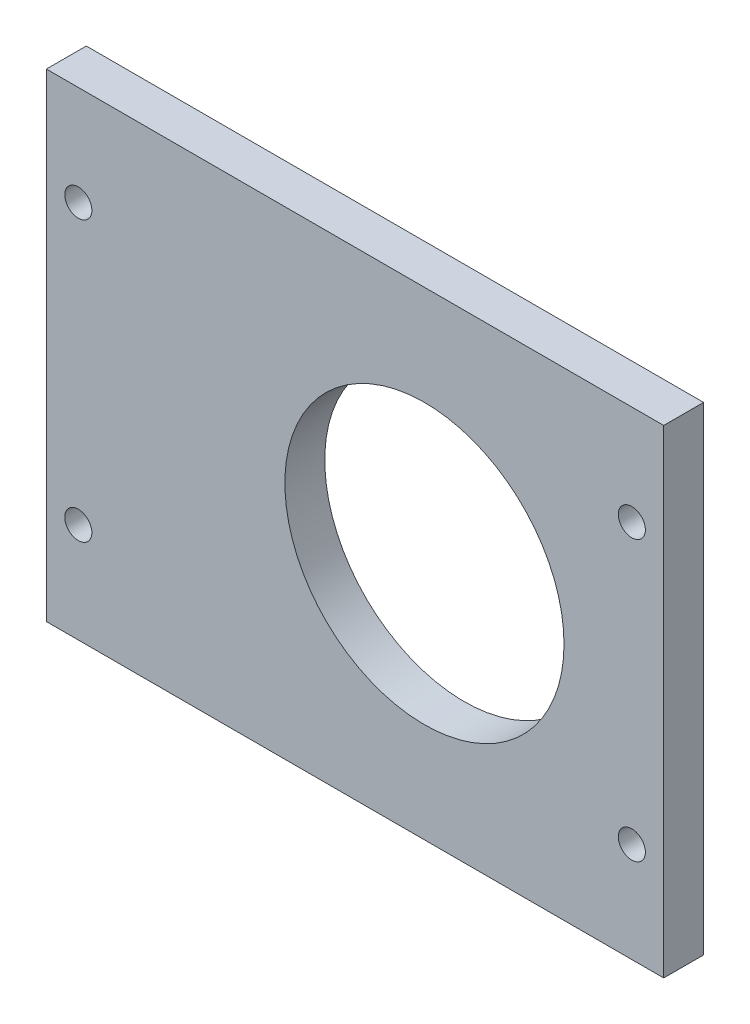
ISO-10303-21;
HEADER;
FILE_DESCRIPTION(('STEP AP214'),'2;1');
FILE_NAME('part.step','',(''),(''),'','','');
FILE_SCHEMA(('AUTOMOTIVE_DESIGN { 1 0 10303 214 1 1 1 1 }'));
ENDSEC;
DATA;
#1=APPLICATION_CONTEXT('core data for automotive mechanical design processes');
#2=APPLICATION_PROTOCOL_DEFINITION('international standard','automotive_design',2000,#1);
#3=PRODUCT_CONTEXT('',#1,'mechanical');
#4=PRODUCT('Part','Part','',(#3));
#5=PRODUCT_RELATED_PRODUCT_CATEGORY('part','',(#4));
#6=PRODUCT_DEFINITION_FORMATION('','',#4);
#7=PRODUCT_DEFINITION_CONTEXT('part definition',#1,'design');
#8=PRODUCT_DEFINITION('design','',#6,#7);
#9=PRODUCT_DEFINITION_SHAPE('','',#8);
#10=(LENGTH_UNIT() NAMED_UNIT(*) SI_UNIT(.MILLI.,.METRE.));
#11=(NAMED_UNIT(*) PLANE_ANGLE_UNIT() SI_UNIT($,.RADIAN.));
#12=(NAMED_UNIT(*) SI_UNIT($,.STERADIAN.) SOLID_ANGLE_UNIT());
#13=UNCERTAINTY_MEASURE_WITH_UNIT(LENGTH_MEASURE(1.E-05),#10,'distance_accuracy_value','');
#14=(GEOMETRIC_REPRESENTATION_CONTEXT(3) GLOBAL_UNCERTAINTY_ASSIGNED_CONTEXT((#13)) GLOBAL_UNIT_ASSIGNED_CONTEXT((#10,
#11,#12)) REPRESENTATION_CONTEXT('',''));
#15=CARTESIAN_POINT('',(0.,0.,0.));
#16=DIRECTION('',(0.,0.,1.));
#17=DIRECTION('',(1.,0.,0.));
#18=AXIS2_PLACEMENT_3D('',#15,#16,#17);
#19=CARTESIAN_POINT('',(0.,0.,0.));
#20=DIRECTION('',(0.,0.,-1.));
#21=DIRECTION('',(-1.,0.,0.));
#22=AXIS2_PLACEMENT_3D('',#19,#20,#21);
#23=PLANE('',#22);
#24=CARTESIAN_POINT('',(73.4,47.5,0.));
#25=DIRECTION('',(0.,0.,1.));
#26=DIRECTION('',(1.,0.,0.));
#27=AXIS2_PLACEMENT_3D('',#24,#25,#26);
#28=CIRCLE('',#27,1.69999999999999);
#29=CARTESIAN_POINT('',(75.1,47.5,0.));
#30=VERTEX_POINT('',#29);
#31=EDGE_CURVE('E142',#30,#30,#28,.T.);
#32=ORIENTED_EDGE('',*,*,#31,.T.);
#33=EDGE_LOOP('',(#32));
#34=FACE_BOUND('',#33,.T.);
#35=CARTESIAN_POINT('',(73.4,12.5,0.));
#36=DIRECTION('',(0.,0.,1.));
#37=DIRECTION('',(1.,0.,0.));
#38=AXIS2_PLACEMENT_3D('',#35,#36,#37);
#39=CIRCLE('',#38,1.69999999999999);
#40=CARTESIAN_POINT('',(75.1,12.5,0.));
#41=VERTEX_POINT('',#40);
#42=EDGE_CURVE('E136',#41,#41,#39,.T.);
#43=ORIENTED_EDGE('',*,*,#42,.T.);
#44=EDGE_LOOP('',(#43));
#45=FACE_BOUND('',#44,.T.);
#46=CARTESIAN_POINT('',(4.,47.5,0.));
#47=DIRECTION('',(0.,0.,1.));
#48=DIRECTION('',(1.,0.,0.));
#49=AXIS2_PLACEMENT_3D('',#46,#47,#48);
#50=CIRCLE('',#49,1.69999999999999);
#51=CARTESIAN_POINT('',(5.69999999999999,47.5,0.));
#52=VERTEX_POINT('',#51);
#53=EDGE_CURVE('E122',#52,#52,#50,.T.);
#54=ORIENTED_EDGE('',*,*,#53,.T.);
#55=EDGE_LOOP('',(#54));
#56=FACE_BOUND('',#55,.T.);
#57=CARTESIAN_POINT('',(47.4,30.,0.));
#58=DIRECTION('',(0.,0.,1.));
#59=DIRECTION('',(1.,0.,0.));
#60=AXIS2_PLACEMENT_3D('',#57,#58,#59);
#61=CIRCLE('',#60,17.5);
#62=CARTESIAN_POINT('',(64.9,30.,0.));
#63=VERTEX_POINT('',#62);
#64=EDGE_CURVE('E108',#63,#63,#61,.T.);
#65=ORIENTED_EDGE('',*,*,#64,.T.);
#66=EDGE_LOOP('',(#65));
#67=FACE_BOUND('',#66,.T.);
#68=DIRECTION('',(0.,-1.,0.));
#69=VECTOR('',#68,1.);
#70=CARTESIAN_POINT('',(0.,0.,0.));
#71=LINE('',#70,#69);
#72=CARTESIAN_POINT('',(0.,60.,0.));
#73=VERTEX_POINT('',#72);
#74=CARTESIAN_POINT('',(0.,0.,0.));
#75=VERTEX_POINT('',#74);
#76=EDGE_CURVE('E105',#73,#75,#71,.T.);
#77=ORIENTED_EDGE('',*,*,#76,.F.);
#78=DIRECTION('',(-1.,0.,0.));
#79=VECTOR('',#78,1.);
#80=CARTESIAN_POINT('',(0.,60.,0.));
#81=LINE('',#80,#79);
#82=CARTESIAN_POINT('',(77.4,60.,0.));
#83=VERTEX_POINT('',#82);
#84=EDGE_CURVE('E81',#83,#73,#81,.T.);
#85=ORIENTED_EDGE('',*,*,#84,.F.);
#86=DIRECTION('',(0.,1.,0.));
#87=VECTOR('',#86,1.);
#88=CARTESIAN_POINT('',(77.4,0.,0.));
#89=LINE('',#88,#87);
#90=CARTESIAN_POINT('',(77.4,0.,0.));
#91=VERTEX_POINT('',#90);
#92=EDGE_CURVE('E75',#91,#83,#89,.T.);
#93=ORIENTED_EDGE('',*,*,#92,.F.);
#94=DIRECTION('',(1.,0.,0.));
#95=VECTOR('',#94,1.);
#96=CARTESIAN_POINT('',(0.,0.,0.));
#97=LINE('',#96,#95);
#98=EDGE_CURVE('E97',#75,#91,#97,.T.);
#99=ORIENTED_EDGE('',*,*,#98,.F.);
#100=EDGE_LOOP('',(#77,#85,#93,#99));
#101=FACE_BOUND('',#100,.T.);
#102=CARTESIAN_POINT('',(4.,12.5,0.));
#103=DIRECTION('',(0.,0.,1.));
#104=DIRECTION('',(1.,0.,0.));
#105=AXIS2_PLACEMENT_3D('',#102,#103,#104);
#106=CIRCLE('',#105,1.69999999999999);
#107=CARTESIAN_POINT('',(5.69999999999999,12.5,0.));
#108=VERTEX_POINT('',#107);
#109=EDGE_CURVE('E130',#108,#108,#106,.T.);
#110=ORIENTED_EDGE('',*,*,#109,.T.);
#111=EDGE_LOOP('',(#110));
#112=FACE_BOUND('',#111,.T.);
#113=ADVANCED_FACE('F41',(#34,#45,#56,#67,#101,#112),#23,.T.);
#114=CARTESIAN_POINT('',(0.,0.,5.));
#115=DIRECTION('',(1.,0.,0.));
#116=DIRECTION('',(0.,0.,-1.));
#117=AXIS2_PLACEMENT_3D('',#114,#115,#116);
#118=PLANE('',#117);
#119=ORIENTED_EDGE('',*,*,#76,.T.);
#120=DIRECTION('',(0.,0.,-1.));
#121=VECTOR('',#120,1.);
#122=CARTESIAN_POINT('',(0.,0.,5.));
#123=LINE('',#122,#121);
#124=CARTESIAN_POINT('',(0.,0.,5.));
#125=VERTEX_POINT('',#124);
#126=EDGE_CURVE('E11',#125,#75,#123,.T.);
#127=ORIENTED_EDGE('',*,*,#126,.F.);
#128=DIRECTION('',(0.,-1.,0.));
#129=VECTOR('',#128,1.);
#130=CARTESIAN_POINT('',(0.,0.,5.));
#131=LINE('',#130,#129);
#132=CARTESIAN_POINT('',(0.,60.,5.));
#133=VERTEX_POINT('',#132);
#134=EDGE_CURVE('E93',#133,#125,#131,.T.);
#135=ORIENTED_EDGE('',*,*,#134,.F.);
#136=DIRECTION('',(0.,0.,-1.));
#137=VECTOR('',#136,1.);
#138=CARTESIAN_POINT('',(0.,60.,5.));
#139=LINE('',#138,#137);
#140=EDGE_CURVE('E101',#133,#73,#139,.T.);
#141=ORIENTED_EDGE('',*,*,#140,.T.);
#142=EDGE_LOOP('',(#119,#127,#135,#141));
#143=FACE_BOUND('',#142,.T.);
#144=ADVANCED_FACE('F43',(#143),#118,.F.);
#145=CARTESIAN_POINT('',(0.,0.,5.));
#146=DIRECTION('',(0.,1.,0.));
#147=DIRECTION('',(0.,0.,1.));
#148=AXIS2_PLACEMENT_3D('',#145,#146,#147);
#149=PLANE('',#148);
#150=ORIENTED_EDGE('',*,*,#98,.T.);
#151=DIRECTION('',(0.,0.,-1.));
#152=VECTOR('',#151,1.);
#153=CARTESIAN_POINT('',(77.4,0.,5.));
#154=LINE('',#153,#152);
#155=CARTESIAN_POINT('',(77.4,0.,5.));
#156=VERTEX_POINT('',#155);
#157=EDGE_CURVE('E50',#156,#91,#154,.T.);
#158=ORIENTED_EDGE('',*,*,#157,.F.);
#159=DIRECTION('',(1.,0.,0.));
#160=VECTOR('',#159,1.);
#161=CARTESIAN_POINT('',(0.,0.,5.));
#162=LINE('',#161,#160);
#163=EDGE_CURVE('E88',#125,#156,#162,.T.);
#164=ORIENTED_EDGE('',*,*,#163,.F.);
#165=ORIENTED_EDGE('',*,*,#126,.T.);
#166=EDGE_LOOP('',(#150,#158,#164,#165));
#167=FACE_BOUND('',#166,.T.);
#168=ADVANCED_FACE('F96',(#167),#149,.F.);
#169=CARTESIAN_POINT('',(77.4,0.,5.));
#170=DIRECTION('',(-1.,0.,0.));
#171=DIRECTION('',(0.,0.,1.));
#172=AXIS2_PLACEMENT_3D('',#169,#170,#171);
#173=PLANE('',#172);
#174=ORIENTED_EDGE('',*,*,#92,.T.);
#175=DIRECTION('',(0.,0.,-1.));
#176=VECTOR('',#175,1.);
#177=CARTESIAN_POINT('',(77.4,60.,5.));
#178=LINE('',#177,#176);
#179=CARTESIAN_POINT('',(77.4,60.,5.));
#180=VERTEX_POINT('',#179);
#181=EDGE_CURVE('E98',#180,#83,#178,.T.);
#182=ORIENTED_EDGE('',*,*,#181,.F.);
#183=DIRECTION('',(0.,1.,0.));
#184=VECTOR('',#183,1.);
#185=CARTESIAN_POINT('',(77.4,0.,5.));
#186=LINE('',#185,#184);
#187=EDGE_CURVE('E91',#156,#180,#186,.T.);
#188=ORIENTED_EDGE('',*,*,#187,.F.);
#189=ORIENTED_EDGE('',*,*,#157,.T.);
#190=EDGE_LOOP('',(#174,#182,#188,#189));
#191=FACE_BOUND('',#190,.T.);
#192=ADVANCED_FACE('F99',(#191),#173,.F.);
#193=CARTESIAN_POINT('',(0.,60.,5.));
#194=DIRECTION('',(0.,-1.,0.));
#195=DIRECTION('',(0.,0.,-1.));
#196=AXIS2_PLACEMENT_3D('',#193,#194,#195);
#197=PLANE('',#196);
#198=ORIENTED_EDGE('',*,*,#84,.T.);
#199=ORIENTED_EDGE('',*,*,#140,.F.);
#200=DIRECTION('',(-1.,0.,0.));
#201=VECTOR('',#200,1.);
#202=CARTESIAN_POINT('',(0.,60.,5.));
#203=LINE('',#202,#201);
#204=EDGE_CURVE('E58',#180,#133,#203,.T.);
#205=ORIENTED_EDGE('',*,*,#204,.F.);
#206=ORIENTED_EDGE('',*,*,#181,.T.);
#207=EDGE_LOOP('',(#198,#199,#205,#206));
#208=FACE_BOUND('',#207,.T.);
#209=ADVANCED_FACE('F113',(#208),#197,.F.);
#210=CARTESIAN_POINT('',(0.,0.,5.));
#211=DIRECTION('',(0.,0.,-1.));
#212=DIRECTION('',(-1.,0.,0.));
#213=AXIS2_PLACEMENT_3D('',#210,#211,#212);
#214=PLANE('',#213);
#215=CARTESIAN_POINT('',(73.4,47.5,5.));
#216=DIRECTION('',(0.,0.,1.));
#217=DIRECTION('',(1.,0.,0.));
#218=AXIS2_PLACEMENT_3D('',#215,#216,#217);
#219=CIRCLE('',#218,1.69999999999999);
#220=CARTESIAN_POINT('',(75.1,47.5,5.));
#221=VERTEX_POINT('',#220);
#222=EDGE_CURVE('E145',#221,#221,#219,.T.);
#223=ORIENTED_EDGE('',*,*,#222,.F.);
#224=EDGE_LOOP('',(#223));
#225=FACE_BOUND('',#224,.T.);
#226=CARTESIAN_POINT('',(73.4,12.5,5.));
#227=DIRECTION('',(0.,0.,1.));
#228=DIRECTION('',(1.,0.,0.));
#229=AXIS2_PLACEMENT_3D('',#226,#227,#228);
#230=CIRCLE('',#229,1.69999999999999);
#231=CARTESIAN_POINT('',(75.1,12.5,5.));
#232=VERTEX_POINT('',#231);
#233=EDGE_CURVE('E139',#232,#232,#230,.T.);
#234=ORIENTED_EDGE('',*,*,#233,.F.);
#235=EDGE_LOOP('',(#234));
#236=FACE_BOUND('',#235,.T.);
#237=CARTESIAN_POINT('',(4.,12.5,5.));
#238=DIRECTION('',(0.,0.,1.));
#239=DIRECTION('',(1.,0.,0.));
#240=AXIS2_PLACEMENT_3D('',#237,#238,#239);
#241=CIRCLE('',#240,1.69999999999999);
#242=CARTESIAN_POINT('',(5.69999999999999,12.5,5.));
#243=VERTEX_POINT('',#242);
#244=EDGE_CURVE('E133',#243,#243,#241,.T.);
#245=ORIENTED_EDGE('',*,*,#244,.F.);
#246=EDGE_LOOP('',(#245));
#247=FACE_BOUND('',#246,.T.);
#248=CARTESIAN_POINT('',(4.,47.5,5.));
#249=DIRECTION('',(0.,0.,1.));
#250=DIRECTION('',(1.,0.,0.));
#251=AXIS2_PLACEMENT_3D('',#248,#249,#250);
#252=CIRCLE('',#251,1.69999999999999);
#253=CARTESIAN_POINT('',(5.69999999999999,47.5,5.));
#254=VERTEX_POINT('',#253);
#255=EDGE_CURVE('E127',#254,#254,#252,.T.);
#256=ORIENTED_EDGE('',*,*,#255,.F.);
#257=EDGE_LOOP('',(#256));
#258=FACE_BOUND('',#257,.T.);
#259=CARTESIAN_POINT('',(47.4,30.,5.));
#260=DIRECTION('',(0.,0.,1.));
#261=DIRECTION('',(1.,0.,0.));
#262=AXIS2_PLACEMENT_3D('',#259,#260,#261);
#263=CIRCLE('',#262,17.5);
#264=CARTESIAN_POINT('',(64.9,30.,5.));
#265=VERTEX_POINT('',#264);
#266=EDGE_CURVE('E119',#265,#265,#263,.T.);
#267=ORIENTED_EDGE('',*,*,#266,.F.);
#268=EDGE_LOOP('',(#267));
#269=FACE_BOUND('',#268,.T.);
#270=ORIENTED_EDGE('',*,*,#134,.T.);
#271=ORIENTED_EDGE('',*,*,#163,.T.);
#272=ORIENTED_EDGE('',*,*,#187,.T.);
#273=ORIENTED_EDGE('',*,*,#204,.T.);
#274=EDGE_LOOP('',(#270,#271,#272,#273));
#275=FACE_BOUND('',#274,.T.);
#276=ADVANCED_FACE('F89',(#225,#236,#247,#258,#269,#275),#214,.F.);
#277=CARTESIAN_POINT('',(47.4,30.,0.));
#278=DIRECTION('',(0.,0.,1.));
#279=DIRECTION('',(1.,0.,0.));
#280=AXIS2_PLACEMENT_3D('',#277,#278,#279);
#281=CYLINDRICAL_SURFACE('',#280,17.5);
#282=ORIENTED_EDGE('',*,*,#64,.F.);
#283=EDGE_LOOP('',(#282));
#284=FACE_BOUND('',#283,.T.);
#285=ORIENTED_EDGE('',*,*,#266,.T.);
#286=EDGE_LOOP('',(#285));
#287=FACE_BOUND('',#286,.T.);
#288=ADVANCED_FACE('F153',(#284,#287),#281,.F.);
#289=CARTESIAN_POINT('',(4.,47.5,5.));
#290=DIRECTION('',(0.,0.,1.));
#291=DIRECTION('',(1.,0.,0.));
#292=AXIS2_PLACEMENT_3D('',#289,#290,#291);
#293=CYLINDRICAL_SURFACE('',#292,1.69999999999999);
#294=ORIENTED_EDGE('',*,*,#53,.F.);
#295=EDGE_LOOP('',(#294));
#296=FACE_BOUND('',#295,.T.);
#297=ORIENTED_EDGE('',*,*,#255,.T.);
#298=EDGE_LOOP('',(#297));
#299=FACE_BOUND('',#298,.T.);
#300=ADVANCED_FACE('F164',(#296,#299),#293,.F.);
#301=CARTESIAN_POINT('',(4.,12.5,5.));
#302=DIRECTION('',(0.,0.,1.));
#303=DIRECTION('',(1.,0.,0.));
#304=AXIS2_PLACEMENT_3D('',#301,#302,#303);
#305=CYLINDRICAL_SURFACE('',#304,1.69999999999999);
#306=ORIENTED_EDGE('',*,*,#109,.F.);
#307=EDGE_LOOP('',(#306));
#308=FACE_BOUND('',#307,.T.);
#309=ORIENTED_EDGE('',*,*,#244,.T.);
#310=EDGE_LOOP('',(#309));
#311=FACE_BOUND('',#310,.T.);
#312=ADVANCED_FACE('F172',(#308,#311),#305,.F.);
#313=CARTESIAN_POINT('',(73.4,12.5,5.));
#314=DIRECTION('',(0.,0.,1.));
#315=DIRECTION('',(1.,0.,0.));
#316=AXIS2_PLACEMENT_3D('',#313,#314,#315);
#317=CYLINDRICAL_SURFACE('',#316,1.69999999999999);
#318=ORIENTED_EDGE('',*,*,#42,.F.);
#319=EDGE_LOOP('',(#318));
#320=FACE_BOUND('',#319,.T.);
#321=ORIENTED_EDGE('',*,*,#233,.T.);
#322=EDGE_LOOP('',(#321));
#323=FACE_BOUND('',#322,.T.);
#324=ADVANCED_FACE('F230',(#320,#323),#317,.F.);
#325=CARTESIAN_POINT('',(73.4,47.5,5.));
#326=DIRECTION('',(0.,0.,1.));
#327=DIRECTION('',(1.,0.,0.));
#328=AXIS2_PLACEMENT_3D('',#325,#326,#327);
#329=CYLINDRICAL_SURFACE('',#328,1.69999999999999);
#330=ORIENTED_EDGE('',*,*,#31,.F.);
#331=EDGE_LOOP('',(#330));
#332=FACE_BOUND('',#331,.T.);
#333=ORIENTED_EDGE('',*,*,#222,.T.);
#334=EDGE_LOOP('',(#333));
#335=FACE_BOUND('',#334,.T.);
#336=ADVANCED_FACE('F149',(#332,#335),#329,.F.);
#337=CLOSED_SHELL('',(#113,#144,#168,#192,#209,#276,#288,#300,#312,#324,#336));
#338=MANIFOLD_SOLID_BREP('B2',#337);
#339=ADVANCED_BREP_SHAPE_REPRESENTATION('',(#18,#338),#14);
#340=SHAPE_DEFINITION_REPRESENTATION(#9,#339);
ENDSEC;
END-ISO-10303-21;
